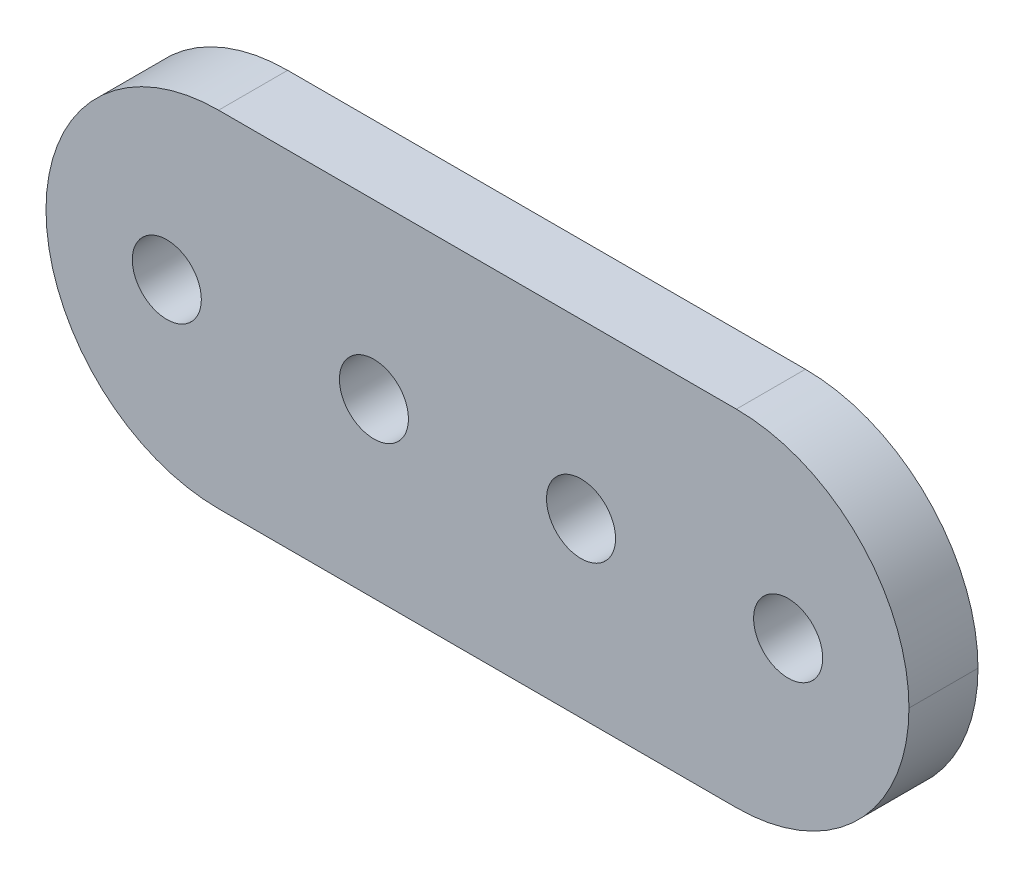
ISO-10303-21;
HEADER;
FILE_DESCRIPTION(('STEP AP214'),'2;1');
FILE_NAME('part.step','',(''),(''),'','','');
FILE_SCHEMA(('AUTOMOTIVE_DESIGN { 1 0 10303 214 1 1 1 1 }'));
ENDSEC;
DATA;
#1=APPLICATION_CONTEXT('core data for automotive mechanical design processes');
#2=APPLICATION_PROTOCOL_DEFINITION('international standard','automotive_design',2000,#1);
#3=PRODUCT_CONTEXT('',#1,'mechanical');
#4=PRODUCT('Part','Part','',(#3));
#5=PRODUCT_RELATED_PRODUCT_CATEGORY('part','',(#4));
#6=PRODUCT_DEFINITION_FORMATION('','',#4);
#7=PRODUCT_DEFINITION_CONTEXT('part definition',#1,'design');
#8=PRODUCT_DEFINITION('design','',#6,#7);
#9=PRODUCT_DEFINITION_SHAPE('','',#8);
#10=(LENGTH_UNIT() NAMED_UNIT(*) SI_UNIT(.MILLI.,.METRE.));
#11=(NAMED_UNIT(*) PLANE_ANGLE_UNIT() SI_UNIT($,.RADIAN.));
#12=(NAMED_UNIT(*) SI_UNIT($,.STERADIAN.) SOLID_ANGLE_UNIT());
#13=UNCERTAINTY_MEASURE_WITH_UNIT(LENGTH_MEASURE(1.E-05),#10,'distance_accuracy_value','');
#14=(GEOMETRIC_REPRESENTATION_CONTEXT(3) GLOBAL_UNCERTAINTY_ASSIGNED_CONTEXT((#13)) GLOBAL_UNIT_ASSIGNED_CONTEXT((#10,
#11,#12)) REPRESENTATION_CONTEXT('',''));
#15=CARTESIAN_POINT('',(0.,0.,0.));
#16=DIRECTION('',(0.,0.,1.));
#17=DIRECTION('',(1.,0.,0.));
#18=AXIS2_PLACEMENT_3D('',#15,#16,#17);
#19=CARTESIAN_POINT('',(0.,0.,4.));
#20=DIRECTION('',(0.,0.,1.));
#21=DIRECTION('',(1.,0.,0.));
#22=AXIS2_PLACEMENT_3D('',#19,#20,#21);
#23=PLANE('',#22);
#24=CARTESIAN_POINT('',(31.,-10.,4.));
#25=DIRECTION('',(0.,0.,1.));
#26=DIRECTION('',(1.,0.,0.));
#27=AXIS2_PLACEMENT_3D('',#24,#25,#26);
#28=CIRCLE('',#27,2.);
#29=CARTESIAN_POINT('',(33.,-10.,4.));
#30=VERTEX_POINT('',#29);
#31=EDGE_CURVE('E159',#30,#30,#28,.T.);
#32=ORIENTED_EDGE('',*,*,#31,.F.);
#33=EDGE_LOOP('',(#32));
#34=FACE_BOUND('',#33,.T.);
#35=CARTESIAN_POINT('',(7.,-10.,4.));
#36=DIRECTION('',(0.,0.,1.));
#37=DIRECTION('',(1.,0.,0.));
#38=AXIS2_PLACEMENT_3D('',#35,#36,#37);
#39=CIRCLE('',#38,2.);
#40=CARTESIAN_POINT('',(9.,-10.,4.));
#41=VERTEX_POINT('',#40);
#42=EDGE_CURVE('E120',#41,#41,#39,.T.);
#43=ORIENTED_EDGE('',*,*,#42,.F.);
#44=EDGE_LOOP('',(#43));
#45=FACE_BOUND('',#44,.T.);
#46=CARTESIAN_POINT('',(40.,-10.,4.));
#47=DIRECTION('',(0.,0.,1.));
#48=DIRECTION('',(1.,0.,0.));
#49=AXIS2_PLACEMENT_3D('',#46,#47,#48);
#50=CIRCLE('',#49,10.);
#51=CARTESIAN_POINT('',(40.,-20.,4.));
#52=VERTEX_POINT('',#51);
#53=CARTESIAN_POINT('',(50.,-10.,4.));
#54=VERTEX_POINT('',#53);
#55=EDGE_CURVE('E52',#52,#54,#50,.T.);
#56=ORIENTED_EDGE('',*,*,#55,.T.);
#57=CARTESIAN_POINT('',(40.,-10.,4.));
#58=DIRECTION('',(0.,0.,1.));
#59=DIRECTION('',(1.,0.,0.));
#60=AXIS2_PLACEMENT_3D('',#57,#58,#59);
#61=CIRCLE('',#60,10.);
#62=CARTESIAN_POINT('',(40.,0.,4.));
#63=VERTEX_POINT('',#62);
#64=EDGE_CURVE('E133',#54,#63,#61,.T.);
#65=ORIENTED_EDGE('',*,*,#64,.T.);
#66=DIRECTION('',(-1.,0.,0.));
#67=VECTOR('',#66,1.);
#68=CARTESIAN_POINT('',(0.,0.,4.));
#69=LINE('',#68,#67);
#70=CARTESIAN_POINT('',(10.,0.,4.));
#71=VERTEX_POINT('',#70);
#72=EDGE_CURVE('E109',#63,#71,#69,.T.);
#73=ORIENTED_EDGE('',*,*,#72,.T.);
#74=CARTESIAN_POINT('',(10.,-10.,4.));
#75=DIRECTION('',(0.,0.,1.));
#76=DIRECTION('',(1.,0.,0.));
#77=AXIS2_PLACEMENT_3D('',#74,#75,#76);
#78=CIRCLE('',#77,10.);
#79=CARTESIAN_POINT('',(0.,-10.,4.));
#80=VERTEX_POINT('',#79);
#81=EDGE_CURVE('E99',#71,#80,#78,.T.);
#82=ORIENTED_EDGE('',*,*,#81,.T.);
#83=CARTESIAN_POINT('',(10.,-10.,4.));
#84=DIRECTION('',(0.,0.,1.));
#85=DIRECTION('',(1.,0.,0.));
#86=AXIS2_PLACEMENT_3D('',#83,#84,#85);
#87=CIRCLE('',#86,10.);
#88=CARTESIAN_POINT('',(10.,-20.,4.));
#89=VERTEX_POINT('',#88);
#90=EDGE_CURVE('E130',#80,#89,#87,.T.);
#91=ORIENTED_EDGE('',*,*,#90,.T.);
#92=DIRECTION('',(1.,0.,0.));
#93=VECTOR('',#92,1.);
#94=CARTESIAN_POINT('',(0.,-20.,4.));
#95=LINE('',#94,#93);
#96=EDGE_CURVE('E116',#89,#52,#95,.T.);
#97=ORIENTED_EDGE('',*,*,#96,.T.);
#98=EDGE_LOOP('',(#56,#65,#73,#82,#91,#97));
#99=FACE_BOUND('',#98,.T.);
#100=CARTESIAN_POINT('',(19.,-10.,4.));
#101=DIRECTION('',(0.,0.,1.));
#102=DIRECTION('',(1.,0.,0.));
#103=AXIS2_PLACEMENT_3D('',#100,#101,#102);
#104=CIRCLE('',#103,2.);
#105=CARTESIAN_POINT('',(21.,-10.,4.));
#106=VERTEX_POINT('',#105);
#107=EDGE_CURVE('E153',#106,#106,#104,.T.);
#108=ORIENTED_EDGE('',*,*,#107,.F.);
#109=EDGE_LOOP('',(#108));
#110=FACE_BOUND('',#109,.T.);
#111=CARTESIAN_POINT('',(43.,-10.,4.));
#112=DIRECTION('',(0.,0.,1.));
#113=DIRECTION('',(1.,0.,0.));
#114=AXIS2_PLACEMENT_3D('',#111,#112,#113);
#115=CIRCLE('',#114,2.);
#116=CARTESIAN_POINT('',(45.,-10.,4.));
#117=VERTEX_POINT('',#116);
#118=EDGE_CURVE('E138',#117,#117,#115,.T.);
#119=ORIENTED_EDGE('',*,*,#118,.F.);
#120=EDGE_LOOP('',(#119));
#121=FACE_BOUND('',#120,.T.);
#122=ADVANCED_FACE('F35',(#34,#45,#99,#110,#121),#23,.T.);
#123=CARTESIAN_POINT('',(0.,0.,0.));
#124=DIRECTION('',(0.,0.,1.));
#125=DIRECTION('',(1.,0.,0.));
#126=AXIS2_PLACEMENT_3D('',#123,#124,#125);
#127=PLANE('',#126);
#128=DIRECTION('',(-1.,0.,0.));
#129=VECTOR('',#128,1.);
#130=CARTESIAN_POINT('',(0.,0.,0.));
#131=LINE('',#130,#129);
#132=CARTESIAN_POINT('',(40.,0.,0.));
#133=VERTEX_POINT('',#132);
#134=CARTESIAN_POINT('',(10.,0.,0.));
#135=VERTEX_POINT('',#134);
#136=EDGE_CURVE('E106',#133,#135,#131,.T.);
#137=ORIENTED_EDGE('',*,*,#136,.F.);
#138=CARTESIAN_POINT('',(40.,-10.,0.));
#139=DIRECTION('',(0.,0.,1.));
#140=DIRECTION('',(1.,0.,0.));
#141=AXIS2_PLACEMENT_3D('',#138,#139,#140);
#142=CIRCLE('',#141,10.);
#143=CARTESIAN_POINT('',(50.,-10.,0.));
#144=VERTEX_POINT('',#143);
#145=EDGE_CURVE('E90',#133,#144,#142,.F.);
#146=ORIENTED_EDGE('',*,*,#145,.T.);
#147=CARTESIAN_POINT('',(40.,-10.,0.));
#148=DIRECTION('',(0.,0.,1.));
#149=DIRECTION('',(1.,0.,0.));
#150=AXIS2_PLACEMENT_3D('',#147,#148,#149);
#151=CIRCLE('',#150,10.);
#152=CARTESIAN_POINT('',(40.,-20.,0.));
#153=VERTEX_POINT('',#152);
#154=EDGE_CURVE('E100',#144,#153,#151,.F.);
#155=ORIENTED_EDGE('',*,*,#154,.T.);
#156=DIRECTION('',(1.,0.,0.));
#157=VECTOR('',#156,1.);
#158=CARTESIAN_POINT('',(0.,-20.,0.));
#159=LINE('',#158,#157);
#160=CARTESIAN_POINT('',(10.,-20.,0.));
#161=VERTEX_POINT('',#160);
#162=EDGE_CURVE('E117',#161,#153,#159,.T.);
#163=ORIENTED_EDGE('',*,*,#162,.F.);
#164=CARTESIAN_POINT('',(10.,-10.,0.));
#165=DIRECTION('',(0.,0.,1.));
#166=DIRECTION('',(1.,0.,0.));
#167=AXIS2_PLACEMENT_3D('',#164,#165,#166);
#168=CIRCLE('',#167,10.);
#169=CARTESIAN_POINT('',(0.,-10.,0.));
#170=VERTEX_POINT('',#169);
#171=EDGE_CURVE('E126',#161,#170,#168,.F.);
#172=ORIENTED_EDGE('',*,*,#171,.T.);
#173=CARTESIAN_POINT('',(10.,-10.,0.));
#174=DIRECTION('',(0.,0.,1.));
#175=DIRECTION('',(1.,0.,0.));
#176=AXIS2_PLACEMENT_3D('',#173,#174,#175);
#177=CIRCLE('',#176,10.);
#178=EDGE_CURVE('E110',#170,#135,#177,.F.);
#179=ORIENTED_EDGE('',*,*,#178,.T.);
#180=EDGE_LOOP('',(#137,#146,#155,#163,#172,#179));
#181=FACE_BOUND('',#180,.T.);
#182=CARTESIAN_POINT('',(7.,-10.,0.));
#183=DIRECTION('',(0.,0.,1.));
#184=DIRECTION('',(1.,0.,0.));
#185=AXIS2_PLACEMENT_3D('',#182,#183,#184);
#186=CIRCLE('',#185,2.);
#187=CARTESIAN_POINT('',(9.,-10.,0.));
#188=VERTEX_POINT('',#187);
#189=EDGE_CURVE('E150',#188,#188,#186,.T.);
#190=ORIENTED_EDGE('',*,*,#189,.T.);
#191=EDGE_LOOP('',(#190));
#192=FACE_BOUND('',#191,.T.);
#193=CARTESIAN_POINT('',(19.,-10.,0.));
#194=DIRECTION('',(0.,0.,1.));
#195=DIRECTION('',(1.,0.,0.));
#196=AXIS2_PLACEMENT_3D('',#193,#194,#195);
#197=CIRCLE('',#196,2.);
#198=CARTESIAN_POINT('',(21.,-10.,0.));
#199=VERTEX_POINT('',#198);
#200=EDGE_CURVE('E156',#199,#199,#197,.T.);
#201=ORIENTED_EDGE('',*,*,#200,.T.);
#202=EDGE_LOOP('',(#201));
#203=FACE_BOUND('',#202,.T.);
#204=CARTESIAN_POINT('',(31.,-10.,0.));
#205=DIRECTION('',(0.,0.,1.));
#206=DIRECTION('',(1.,0.,0.));
#207=AXIS2_PLACEMENT_3D('',#204,#205,#206);
#208=CIRCLE('',#207,2.);
#209=CARTESIAN_POINT('',(33.,-10.,0.));
#210=VERTEX_POINT('',#209);
#211=EDGE_CURVE('E162',#210,#210,#208,.T.);
#212=ORIENTED_EDGE('',*,*,#211,.T.);
#213=EDGE_LOOP('',(#212));
#214=FACE_BOUND('',#213,.T.);
#215=CARTESIAN_POINT('',(43.,-10.,0.));
#216=DIRECTION('',(0.,0.,1.));
#217=DIRECTION('',(1.,0.,0.));
#218=AXIS2_PLACEMENT_3D('',#215,#216,#217);
#219=CIRCLE('',#218,2.);
#220=CARTESIAN_POINT('',(45.,-10.,0.));
#221=VERTEX_POINT('',#220);
#222=EDGE_CURVE('E136',#221,#221,#219,.T.);
#223=ORIENTED_EDGE('',*,*,#222,.T.);
#224=EDGE_LOOP('',(#223));
#225=FACE_BOUND('',#224,.T.);
#226=ADVANCED_FACE('F113',(#181,#192,#203,#214,#225),#127,.F.);
#227=CARTESIAN_POINT('',(0.,-20.,4.));
#228=DIRECTION('',(0.,1.,0.));
#229=DIRECTION('',(0.,0.,1.));
#230=AXIS2_PLACEMENT_3D('',#227,#228,#229);
#231=PLANE('',#230);
#232=ORIENTED_EDGE('',*,*,#162,.T.);
#233=DIRECTION('',(0.,0.,-1.));
#234=VECTOR('',#233,1.);
#235=CARTESIAN_POINT('',(40.,-20.,4.));
#236=LINE('',#235,#234);
#237=EDGE_CURVE('E11',#153,#52,#236,.F.);
#238=ORIENTED_EDGE('',*,*,#237,.T.);
#239=ORIENTED_EDGE('',*,*,#96,.F.);
#240=DIRECTION('',(0.,0.,-1.));
#241=VECTOR('',#240,1.);
#242=CARTESIAN_POINT('',(10.,-20.,4.));
#243=LINE('',#242,#241);
#244=EDGE_CURVE('E44',#89,#161,#243,.T.);
#245=ORIENTED_EDGE('',*,*,#244,.T.);
#246=EDGE_LOOP('',(#232,#238,#239,#245));
#247=FACE_BOUND('',#246,.T.);
#248=ADVANCED_FACE('F179',(#247),#231,.F.);
#249=CARTESIAN_POINT('',(0.,0.,4.));
#250=DIRECTION('',(0.,-1.,0.));
#251=DIRECTION('',(0.,0.,-1.));
#252=AXIS2_PLACEMENT_3D('',#249,#250,#251);
#253=PLANE('',#252);
#254=ORIENTED_EDGE('',*,*,#72,.F.);
#255=DIRECTION('',(0.,0.,-1.));
#256=VECTOR('',#255,1.);
#257=CARTESIAN_POINT('',(40.,0.,4.));
#258=LINE('',#257,#256);
#259=EDGE_CURVE('E94',#63,#133,#258,.T.);
#260=ORIENTED_EDGE('',*,*,#259,.T.);
#261=ORIENTED_EDGE('',*,*,#136,.T.);
#262=DIRECTION('',(0.,0.,-1.));
#263=VECTOR('',#262,1.);
#264=CARTESIAN_POINT('',(10.,0.,4.));
#265=LINE('',#264,#263);
#266=EDGE_CURVE('E111',#135,#71,#265,.F.);
#267=ORIENTED_EDGE('',*,*,#266,.T.);
#268=EDGE_LOOP('',(#254,#260,#261,#267));
#269=FACE_BOUND('',#268,.T.);
#270=ADVANCED_FACE('F105',(#269),#253,.F.);
#271=CARTESIAN_POINT('',(7.,-10.,4.));
#272=DIRECTION('',(0.,0.,-1.));
#273=DIRECTION('',(-1.,0.,0.));
#274=AXIS2_PLACEMENT_3D('',#271,#272,#273);
#275=CYLINDRICAL_SURFACE('',#274,2.);
#276=ORIENTED_EDGE('',*,*,#42,.T.);
#277=EDGE_LOOP('',(#276));
#278=FACE_BOUND('',#277,.T.);
#279=ORIENTED_EDGE('',*,*,#189,.F.);
#280=EDGE_LOOP('',(#279));
#281=FACE_BOUND('',#280,.T.);
#282=ADVANCED_FACE('F184',(#278,#281),#275,.F.);
#283=CARTESIAN_POINT('',(19.,-10.,4.));
#284=DIRECTION('',(0.,0.,-1.));
#285=DIRECTION('',(-1.,0.,0.));
#286=AXIS2_PLACEMENT_3D('',#283,#284,#285);
#287=CYLINDRICAL_SURFACE('',#286,2.);
#288=ORIENTED_EDGE('',*,*,#107,.T.);
#289=EDGE_LOOP('',(#288));
#290=FACE_BOUND('',#289,.T.);
#291=ORIENTED_EDGE('',*,*,#200,.F.);
#292=EDGE_LOOP('',(#291));
#293=FACE_BOUND('',#292,.T.);
#294=ADVANCED_FACE('F224',(#290,#293),#287,.F.);
#295=CARTESIAN_POINT('',(31.,-10.,4.));
#296=DIRECTION('',(0.,0.,-1.));
#297=DIRECTION('',(-1.,0.,0.));
#298=AXIS2_PLACEMENT_3D('',#295,#296,#297);
#299=CYLINDRICAL_SURFACE('',#298,2.);
#300=ORIENTED_EDGE('',*,*,#31,.T.);
#301=EDGE_LOOP('',(#300));
#302=FACE_BOUND('',#301,.T.);
#303=ORIENTED_EDGE('',*,*,#211,.F.);
#304=EDGE_LOOP('',(#303));
#305=FACE_BOUND('',#304,.T.);
#306=ADVANCED_FACE('F217',(#302,#305),#299,.F.);
#307=CARTESIAN_POINT('',(43.,-10.,4.));
#308=DIRECTION('',(0.,0.,-1.));
#309=DIRECTION('',(-1.,0.,0.));
#310=AXIS2_PLACEMENT_3D('',#307,#308,#309);
#311=CYLINDRICAL_SURFACE('',#310,2.);
#312=ORIENTED_EDGE('',*,*,#118,.T.);
#313=EDGE_LOOP('',(#312));
#314=FACE_BOUND('',#313,.T.);
#315=ORIENTED_EDGE('',*,*,#222,.F.);
#316=EDGE_LOOP('',(#315));
#317=FACE_BOUND('',#316,.T.);
#318=ADVANCED_FACE('F170',(#314,#317),#311,.F.);
#319=CARTESIAN_POINT('',(40.,-10.,4.));
#320=DIRECTION('',(0.,0.,-1.));
#321=DIRECTION('',(-1.,0.,0.));
#322=AXIS2_PLACEMENT_3D('',#319,#320,#321);
#323=CYLINDRICAL_SURFACE('',#322,10.);
#324=DIRECTION('',(0.,0.,-1.));
#325=VECTOR('',#324,1.);
#326=CARTESIAN_POINT('',(50.,-10.,4.));
#327=LINE('',#326,#325);
#328=EDGE_CURVE('E95',#54,#144,#327,.T.);
#329=ORIENTED_EDGE('',*,*,#328,.F.);
#330=ORIENTED_EDGE('',*,*,#55,.F.);
#331=ORIENTED_EDGE('',*,*,#237,.F.);
#332=ORIENTED_EDGE('',*,*,#154,.F.);
#333=EDGE_LOOP('',(#329,#330,#331,#332));
#334=FACE_BOUND('',#333,.T.);
#335=ADVANCED_FACE('F193',(#334),#323,.T.);
#336=CARTESIAN_POINT('',(40.,-10.,4.));
#337=DIRECTION('',(0.,0.,-1.));
#338=DIRECTION('',(-1.,0.,0.));
#339=AXIS2_PLACEMENT_3D('',#336,#337,#338);
#340=CYLINDRICAL_SURFACE('',#339,10.);
#341=ORIENTED_EDGE('',*,*,#64,.F.);
#342=ORIENTED_EDGE('',*,*,#328,.T.);
#343=ORIENTED_EDGE('',*,*,#145,.F.);
#344=ORIENTED_EDGE('',*,*,#259,.F.);
#345=EDGE_LOOP('',(#341,#342,#343,#344));
#346=FACE_BOUND('',#345,.T.);
#347=ADVANCED_FACE('F93',(#346),#340,.T.);
#348=CARTESIAN_POINT('',(10.,-10.,4.));
#349=DIRECTION('',(0.,0.,-1.));
#350=DIRECTION('',(-1.,0.,0.));
#351=AXIS2_PLACEMENT_3D('',#348,#349,#350);
#352=CYLINDRICAL_SURFACE('',#351,10.);
#353=DIRECTION('',(0.,0.,-1.));
#354=VECTOR('',#353,1.);
#355=CARTESIAN_POINT('',(0.,-10.,4.));
#356=LINE('',#355,#354);
#357=EDGE_CURVE('E39',#80,#170,#356,.T.);
#358=ORIENTED_EDGE('',*,*,#357,.F.);
#359=ORIENTED_EDGE('',*,*,#81,.F.);
#360=ORIENTED_EDGE('',*,*,#266,.F.);
#361=ORIENTED_EDGE('',*,*,#178,.F.);
#362=EDGE_LOOP('',(#358,#359,#360,#361));
#363=FACE_BOUND('',#362,.T.);
#364=ADVANCED_FACE('F37',(#363),#352,.T.);
#365=CARTESIAN_POINT('',(10.,-10.,4.));
#366=DIRECTION('',(0.,0.,-1.));
#367=DIRECTION('',(-1.,0.,0.));
#368=AXIS2_PLACEMENT_3D('',#365,#366,#367);
#369=CYLINDRICAL_SURFACE('',#368,10.);
#370=ORIENTED_EDGE('',*,*,#90,.F.);
#371=ORIENTED_EDGE('',*,*,#357,.T.);
#372=ORIENTED_EDGE('',*,*,#171,.F.);
#373=ORIENTED_EDGE('',*,*,#244,.F.);
#374=EDGE_LOOP('',(#370,#371,#372,#373));
#375=FACE_BOUND('',#374,.T.);
#376=ADVANCED_FACE('F144',(#375),#369,.T.);
#377=CLOSED_SHELL('',(#122,#226,#248,#270,#282,#294,#306,#318,#335,#347,#364,#376));
#378=MANIFOLD_SOLID_BREP('B2',#377);
#379=ADVANCED_BREP_SHAPE_REPRESENTATION('',(#18,#378),#14);
#380=SHAPE_DEFINITION_REPRESENTATION(#9,#379);
ENDSEC;
END-ISO-10303-21;
